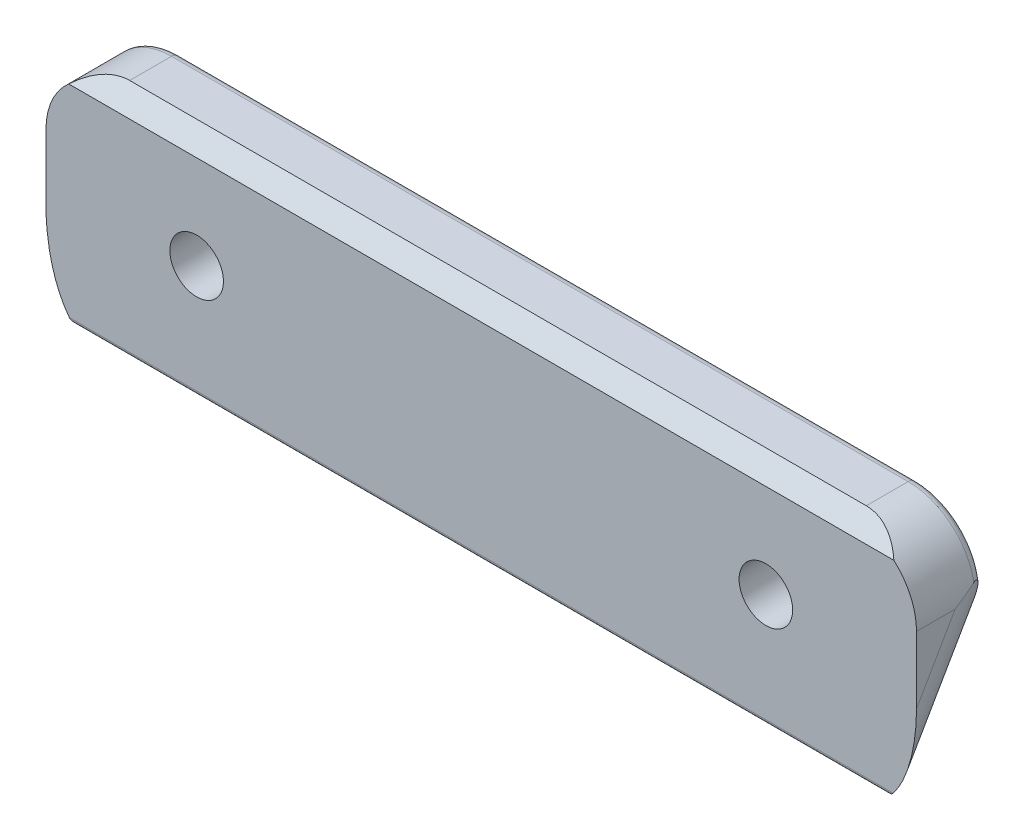
ISO-10303-21;
HEADER;
FILE_DESCRIPTION(('STEP AP214'),'2;1');
FILE_NAME('part.step','',(''),(''),'','','');
FILE_SCHEMA(('AUTOMOTIVE_DESIGN { 1 0 10303 214 1 1 1 1 }'));
ENDSEC;
DATA;
#1=APPLICATION_CONTEXT('core data for automotive mechanical design processes');
#2=APPLICATION_PROTOCOL_DEFINITION('international standard','automotive_design',2000,#1);
#3=PRODUCT_CONTEXT('',#1,'mechanical');
#4=PRODUCT('Part','Part','',(#3));
#5=PRODUCT_RELATED_PRODUCT_CATEGORY('part','',(#4));
#6=PRODUCT_DEFINITION_FORMATION('','',#4);
#7=PRODUCT_DEFINITION_CONTEXT('part definition',#1,'design');
#8=PRODUCT_DEFINITION('design','',#6,#7);
#9=PRODUCT_DEFINITION_SHAPE('','',#8);
#10=(LENGTH_UNIT() NAMED_UNIT(*) SI_UNIT(.MILLI.,.METRE.));
#11=(NAMED_UNIT(*) PLANE_ANGLE_UNIT() SI_UNIT($,.RADIAN.));
#12=(NAMED_UNIT(*) SI_UNIT($,.STERADIAN.) SOLID_ANGLE_UNIT());
#13=UNCERTAINTY_MEASURE_WITH_UNIT(LENGTH_MEASURE(1.E-05),#10,'distance_accuracy_value','');
#14=(GEOMETRIC_REPRESENTATION_CONTEXT(3) GLOBAL_UNCERTAINTY_ASSIGNED_CONTEXT((#13)) GLOBAL_UNIT_ASSIGNED_CONTEXT((#10,
#11,#12)) REPRESENTATION_CONTEXT('',''));
#15=CARTESIAN_POINT('',(0.,0.,0.));
#16=DIRECTION('',(0.,0.,1.));
#17=DIRECTION('',(1.,0.,0.));
#18=AXIS2_PLACEMENT_3D('',#15,#16,#17);
#19=CARTESIAN_POINT('',(73.,3.46410161513782,-2.));
#20=DIRECTION('',(0.,0.,1.));
#21=DIRECTION('',(1.,0.,0.));
#22=AXIS2_PLACEMENT_3D('',#19,#20,#21);
#23=PLANE('',#22);
#24=CARTESIAN_POINT('',(48.5,6.46410161513786,-2.));
#25=DIRECTION('',(0.,0.,1.));
#26=DIRECTION('',(0.,1.,0.));
#27=AXIS2_PLACEMENT_3D('',#24,#25,#26);
#28=ELLIPSE('',#27,3.00000000000004,1.5);
#29=CARTESIAN_POINT('',(48.5,3.46410161513782,-2.));
#30=VERTEX_POINT('',#29);
#31=CARTESIAN_POINT('',(47.2672441064119,4.75493467557492,-2.));
#32=VERTEX_POINT('',#31);
#33=EDGE_CURVE('E334',#30,#32,#28,.F.);
#34=ORIENTED_EDGE('',*,*,#33,.T.);
#35=CARTESIAN_POINT('',(49.,5.,-2.));
#36=DIRECTION('',(0.,0.,1.));
#37=DIRECTION('',(1.,0.,0.));
#38=AXIS2_PLACEMENT_3D('',#35,#36,#37);
#39=CIRCLE('',#38,1.75);
#40=CARTESIAN_POINT('',(49.,6.75,-2.));
#41=VERTEX_POINT('',#40);
#42=EDGE_CURVE('E323',#32,#41,#39,.F.);
#43=ORIENTED_EDGE('',*,*,#42,.T.);
#44=DIRECTION('',(-1.,0.,0.));
#45=VECTOR('',#44,1.);
#46=CARTESIAN_POINT('',(73.,6.75,-2.));
#47=LINE('',#46,#45);
#48=CARTESIAN_POINT('',(71.,6.75,-2.));
#49=VERTEX_POINT('',#48);
#50=EDGE_CURVE('E157',#41,#49,#47,.F.);
#51=ORIENTED_EDGE('',*,*,#50,.T.);
#52=CARTESIAN_POINT('',(71.,5.,-2.));
#53=DIRECTION('',(0.,0.,1.));
#54=DIRECTION('',(1.,0.,0.));
#55=AXIS2_PLACEMENT_3D('',#52,#53,#54);
#56=CIRCLE('',#55,1.75);
#57=CARTESIAN_POINT('',(72.7327558935881,4.75493467557492,-2.));
#58=VERTEX_POINT('',#57);
#59=EDGE_CURVE('E320',#49,#58,#56,.F.);
#60=ORIENTED_EDGE('',*,*,#59,.T.);
#61=CARTESIAN_POINT('',(71.5,6.46410161513786,-2.));
#62=DIRECTION('',(0.,0.,1.));
#63=DIRECTION('',(0.,-1.,0.));
#64=AXIS2_PLACEMENT_3D('',#61,#62,#63);
#65=ELLIPSE('',#64,3.00000000000004,1.5);
#66=CARTESIAN_POINT('',(71.5,3.46410161513782,-2.));
#67=VERTEX_POINT('',#66);
#68=EDGE_CURVE('E173',#58,#67,#65,.F.);
#69=ORIENTED_EDGE('',*,*,#68,.T.);
#70=DIRECTION('',(-1.,0.,0.));
#71=VECTOR('',#70,1.);
#72=CARTESIAN_POINT('',(73.,3.46410161513782,-2.));
#73=LINE('',#72,#71);
#74=CARTESIAN_POINT('',(69.2638081222336,3.46410161513781,-2.));
#75=VERTEX_POINT('',#74);
#76=EDGE_CURVE('E164',#67,#75,#73,.T.);
#77=ORIENTED_EDGE('',*,*,#76,.T.);
#78=CARTESIAN_POINT('',(68.5,3.70200317547306,-2.));
#79=DIRECTION('',(0.,0.,1.));
#80=DIRECTION('',(1.,0.,0.));
#81=AXIS2_PLACEMENT_3D('',#78,#79,#80);
#82=CIRCLE('',#81,0.799999999999988);
#83=CARTESIAN_POINT('',(67.7361918777664,3.46410161513782,-2.));
#84=VERTEX_POINT('',#83);
#85=EDGE_CURVE('E149',#75,#84,#82,.T.);
#86=ORIENTED_EDGE('',*,*,#85,.T.);
#87=CARTESIAN_POINT('',(52.2638081222336,3.46410161513782,-2.));
#88=VERTEX_POINT('',#87);
#89=EDGE_CURVE('E167',#84,#88,#73,.T.);
#90=ORIENTED_EDGE('',*,*,#89,.T.);
#91=CARTESIAN_POINT('',(51.5,3.70200317547306,-2.));
#92=DIRECTION('',(0.,0.,-1.));
#93=DIRECTION('',(-1.,0.,0.));
#94=AXIS2_PLACEMENT_3D('',#91,#92,#93);
#95=CIRCLE('',#94,0.799999999999988);
#96=CARTESIAN_POINT('',(50.7361918777664,3.46410161513782,-2.));
#97=VERTEX_POINT('',#96);
#98=EDGE_CURVE('E169',#97,#88,#95,.T.);
#99=ORIENTED_EDGE('',*,*,#98,.F.);
#100=EDGE_CURVE('E177',#97,#30,#73,.T.);
#101=ORIENTED_EDGE('',*,*,#100,.T.);
#102=EDGE_LOOP('',(#34,#43,#51,#60,#69,#77,#86,#90,#99,#101));
#103=FACE_BOUND('',#102,.T.);
#104=ADVANCED_FACE('F45',(#103),#23,.F.);
#105=CARTESIAN_POINT('',(73.,7.,-2.));
#106=DIRECTION('',(0.,-1.,0.));
#107=DIRECTION('',(0.,0.,-1.));
#108=AXIS2_PLACEMENT_3D('',#105,#106,#107);
#109=PLANE('',#108);
#110=DIRECTION('',(0.,0.,1.));
#111=VECTOR('',#110,1.);
#112=CARTESIAN_POINT('',(71.,7.,-2.));
#113=LINE('',#112,#111);
#114=CARTESIAN_POINT('',(71.,7.,-0.5));
#115=VERTEX_POINT('',#114);
#116=CARTESIAN_POINT('',(71.,7.,-1.75));
#117=VERTEX_POINT('',#116);
#118=EDGE_CURVE('E420',#115,#117,#113,.F.);
#119=ORIENTED_EDGE('',*,*,#118,.T.);
#120=DIRECTION('',(-1.,0.,0.));
#121=VECTOR('',#120,1.);
#122=CARTESIAN_POINT('',(73.,7.,-1.75));
#123=LINE('',#122,#121);
#124=CARTESIAN_POINT('',(49.,7.,-1.75));
#125=VERTEX_POINT('',#124);
#126=EDGE_CURVE('E11',#117,#125,#123,.T.);
#127=ORIENTED_EDGE('',*,*,#126,.T.);
#128=DIRECTION('',(0.,0.,1.));
#129=VECTOR('',#128,1.);
#130=CARTESIAN_POINT('',(49.,7.,-2.));
#131=LINE('',#130,#129);
#132=CARTESIAN_POINT('',(49.,7.,-0.5));
#133=VERTEX_POINT('',#132);
#134=EDGE_CURVE('E293',#125,#133,#131,.T.);
#135=ORIENTED_EDGE('',*,*,#134,.T.);
#136=DIRECTION('',(1.,0.,0.));
#137=VECTOR('',#136,1.);
#138=CARTESIAN_POINT('',(73.,7.,-0.5));
#139=LINE('',#138,#137);
#140=EDGE_CURVE('E375',#133,#115,#139,.T.);
#141=ORIENTED_EDGE('',*,*,#140,.T.);
#142=EDGE_LOOP('',(#119,#127,#135,#141));
#143=FACE_BOUND('',#142,.T.);
#144=ADVANCED_FACE('F250',(#143),#109,.F.);
#145=CARTESIAN_POINT('',(73.,7.,0.));
#146=DIRECTION('',(0.,0.,-1.));
#147=DIRECTION('',(0.,1.,0.));
#148=AXIS2_PLACEMENT_3D('',#145,#146,#147);
#149=PLANE('',#148);
#150=CARTESIAN_POINT('',(68.5,3.70200317547306,0.));
#151=DIRECTION('',(0.,0.,-1.));
#152=DIRECTION('',(-1.,0.,0.));
#153=AXIS2_PLACEMENT_3D('',#150,#151,#152);
#154=CIRCLE('',#153,0.799999999999981);
#155=CARTESIAN_POINT('',(67.7,3.70200317547306,0.));
#156=VERTEX_POINT('',#155);
#157=EDGE_CURVE('E170',#156,#156,#154,.T.);
#158=ORIENTED_EDGE('',*,*,#157,.T.);
#159=EDGE_LOOP('',(#158));
#160=FACE_BOUND('',#159,.T.);
#161=CARTESIAN_POINT('',(51.5,3.70200317547306,0.));
#162=DIRECTION('',(0.,0.,-1.));
#163=DIRECTION('',(-1.,0.,0.));
#164=AXIS2_PLACEMENT_3D('',#161,#162,#163);
#165=CIRCLE('',#164,0.799999999999988);
#166=CARTESIAN_POINT('',(50.7,3.70200317547306,0.));
#167=VERTEX_POINT('',#166);
#168=EDGE_CURVE('E202',#167,#167,#165,.T.);
#169=ORIENTED_EDGE('',*,*,#168,.T.);
#170=EDGE_LOOP('',(#169));
#171=FACE_BOUND('',#170,.T.);
#172=DIRECTION('',(-1.,0.,0.));
#173=VECTOR('',#172,1.);
#174=CARTESIAN_POINT('',(73.,6.50000000000001,0.));
#175=LINE('',#174,#173);
#176=CARTESIAN_POINT('',(72.3228756555323,6.50000000000001,0.));
#177=VERTEX_POINT('',#176);
#178=CARTESIAN_POINT('',(47.6771243444677,6.50000000000001,0.));
#179=VERTEX_POINT('',#178);
#180=EDGE_CURVE('E273',#177,#179,#175,.T.);
#181=ORIENTED_EDGE('',*,*,#180,.T.);
#182=CARTESIAN_POINT('',(49.,5.,0.));
#183=DIRECTION('',(0.,0.,-1.));
#184=DIRECTION('',(0.,1.,0.));
#185=AXIS2_PLACEMENT_3D('',#182,#183,#184);
#186=CIRCLE('',#185,2.);
#187=CARTESIAN_POINT('',(47.,5.,0.));
#188=VERTEX_POINT('',#187);
#189=EDGE_CURVE('E370',#179,#188,#186,.F.);
#190=ORIENTED_EDGE('',*,*,#189,.T.);
#191=DIRECTION('',(0.,1.,0.));
#192=VECTOR('',#191,1.);
#193=CARTESIAN_POINT('',(47.,0.,0.));
#194=LINE('',#193,#192);
#195=CARTESIAN_POINT('',(47.,3.00000000000004,0.));
#196=VERTEX_POINT('',#195);
#197=EDGE_CURVE('E190',#196,#188,#194,.T.);
#198=ORIENTED_EDGE('',*,*,#197,.F.);
#199=CARTESIAN_POINT('',(48.5,3.00000000000004,0.));
#200=DIRECTION('',(0.,0.,-1.));
#201=DIRECTION('',(0.,1.,0.));
#202=AXIS2_PLACEMENT_3D('',#199,#200,#201);
#203=ELLIPSE('',#202,3.00000000000004,1.5);
#204=CARTESIAN_POINT('',(47.6966616637114,0.466506350946117,0.));
#205=VERTEX_POINT('',#204);
#206=EDGE_CURVE('E294',#196,#205,#203,.F.);
#207=ORIENTED_EDGE('',*,*,#206,.T.);
#208=DIRECTION('',(-1.,0.,0.));
#209=VECTOR('',#208,1.);
#210=CARTESIAN_POINT('',(73.,0.466506350946117,0.));
#211=LINE('',#210,#209);
#212=CARTESIAN_POINT('',(72.3033383362886,0.466506350946118,0.));
#213=VERTEX_POINT('',#212);
#214=EDGE_CURVE('E274',#205,#213,#211,.F.);
#215=ORIENTED_EDGE('',*,*,#214,.T.);
#216=CARTESIAN_POINT('',(71.5,3.00000000000004,0.));
#217=DIRECTION('',(0.,0.,-1.));
#218=DIRECTION('',(0.,-1.,0.));
#219=AXIS2_PLACEMENT_3D('',#216,#217,#218);
#220=ELLIPSE('',#219,3.00000000000004,1.5);
#221=CARTESIAN_POINT('',(73.,3.00000000000004,0.));
#222=VERTEX_POINT('',#221);
#223=EDGE_CURVE('E426',#213,#222,#220,.F.);
#224=ORIENTED_EDGE('',*,*,#223,.T.);
#225=DIRECTION('',(0.,-1.,0.));
#226=VECTOR('',#225,1.);
#227=CARTESIAN_POINT('',(73.,7.,0.));
#228=LINE('',#227,#226);
#229=CARTESIAN_POINT('',(73.,5.,0.));
#230=VERTEX_POINT('',#229);
#231=EDGE_CURVE('E184',#230,#222,#228,.T.);
#232=ORIENTED_EDGE('',*,*,#231,.F.);
#233=CARTESIAN_POINT('',(71.,5.,0.));
#234=DIRECTION('',(0.,0.,-1.));
#235=DIRECTION('',(0.,1.,0.));
#236=AXIS2_PLACEMENT_3D('',#233,#234,#235);
#237=CIRCLE('',#236,2.);
#238=EDGE_CURVE('E371',#230,#177,#237,.F.);
#239=ORIENTED_EDGE('',*,*,#238,.T.);
#240=EDGE_LOOP('',(#181,#190,#198,#207,#215,#224,#232,#239));
#241=FACE_BOUND('',#240,.T.);
#242=ADVANCED_FACE('F353',(#160,#171,#241),#149,.F.);
#243=CARTESIAN_POINT('',(73.,0.,0.));
#244=DIRECTION('',(0.,0.499999999999993,0.866025403784442));
#245=DIRECTION('',(0.,-0.866025403784443,0.499999999999993));
#246=AXIS2_PLACEMENT_3D('',#243,#244,#245);
#247=PLANE('',#246);
#248=ORIENTED_EDGE('',*,*,#89,.F.);
#249=CARTESIAN_POINT('',(68.5,3.70200317547306,-2.13735252990018));
#250=DIRECTION('',(0.,0.499999999999993,0.866025403784442));
#251=DIRECTION('',(0.,0.866025403784443,-0.499999999999993));
#252=AXIS2_PLACEMENT_3D('',#249,#250,#251);
#253=ELLIPSE('',#252,0.923760430703384,0.799999999999988);
#254=EDGE_CURVE('E152',#84,#75,#253,.T.);
#255=ORIENTED_EDGE('',*,*,#254,.T.);
#256=ORIENTED_EDGE('',*,*,#76,.F.);
#257=DIRECTION('',(0.,0.866025403784443,-0.499999999999993));
#258=VECTOR('',#257,1.);
#259=CARTESIAN_POINT('',(71.5,0.,0.));
#260=LINE('',#259,#258);
#261=CARTESIAN_POINT('',(71.5,0.404006350946118,-0.233253175473056));
#262=VERTEX_POINT('',#261);
#263=EDGE_CURVE('E429',#67,#262,#260,.F.);
#264=ORIENTED_EDGE('',*,*,#263,.T.);
#265=DIRECTION('',(-1.,0.,0.));
#266=VECTOR('',#265,1.);
#267=CARTESIAN_POINT('',(73.,0.404006350946118,-0.233253175473056));
#268=LINE('',#267,#266);
#269=CARTESIAN_POINT('',(48.5,0.404006350946118,-0.233253175473056));
#270=VERTEX_POINT('',#269);
#271=EDGE_CURVE('E416',#262,#270,#268,.T.);
#272=ORIENTED_EDGE('',*,*,#271,.T.);
#273=DIRECTION('',(0.,0.866025403784443,-0.499999999999993));
#274=VECTOR('',#273,1.);
#275=CARTESIAN_POINT('',(48.5,0.,0.));
#276=LINE('',#275,#274);
#277=EDGE_CURVE('E339',#270,#30,#276,.T.);
#278=ORIENTED_EDGE('',*,*,#277,.T.);
#279=ORIENTED_EDGE('',*,*,#100,.F.);
#280=CARTESIAN_POINT('',(51.5,3.70200317547306,-2.13735252990018));
#281=DIRECTION('',(0.,0.499999999999993,0.866025403784442));
#282=DIRECTION('',(0.,0.866025403784443,-0.499999999999993));
#283=AXIS2_PLACEMENT_3D('',#280,#281,#282);
#284=ELLIPSE('',#283,0.923760430703384,0.799999999999988);
#285=EDGE_CURVE('E197',#97,#88,#284,.T.);
#286=ORIENTED_EDGE('',*,*,#285,.T.);
#287=EDGE_LOOP('',(#248,#255,#256,#264,#272,#278,#279,#286));
#288=FACE_BOUND('',#287,.T.);
#289=ADVANCED_FACE('F162',(#288),#247,.F.);
#290=CARTESIAN_POINT('',(73.,0.,0.));
#291=DIRECTION('',(1.,0.,0.));
#292=DIRECTION('',(0.,0.,-1.));
#293=AXIS2_PLACEMENT_3D('',#290,#291,#292);
#294=PLANE('',#293);
#295=DIRECTION('',(0.,0.866025403784443,-0.499999999999993));
#296=VECTOR('',#295,1.);
#297=CARTESIAN_POINT('',(73.,4.21410161513781,-0.700961894323337));
#298=LINE('',#297,#296);
#299=CARTESIAN_POINT('',(73.,5.,-1.15470053837921));
#300=VERTEX_POINT('',#299);
#301=EDGE_CURVE('E175',#222,#300,#298,.T.);
#302=ORIENTED_EDGE('',*,*,#301,.T.);
#303=DIRECTION('',(0.,0.,1.));
#304=VECTOR('',#303,1.);
#305=CARTESIAN_POINT('',(73.,5.,0.));
#306=LINE('',#305,#304);
#307=EDGE_CURVE('E423',#300,#230,#306,.T.);
#308=ORIENTED_EDGE('',*,*,#307,.T.);
#309=ORIENTED_EDGE('',*,*,#231,.T.);
#310=EDGE_LOOP('',(#302,#308,#309));
#311=FACE_BOUND('',#310,.T.);
#312=ADVANCED_FACE('F249',(#311),#294,.T.);
#313=CARTESIAN_POINT('',(71.5,0.749999999999989,1.29903810567666));
#314=DIRECTION('',(0.,-0.866025403784443,0.499999999999993));
#315=DIRECTION('',(0.,-0.499999999999993,-0.866025403784443));
#316=AXIS2_PLACEMENT_3D('',#313,#314,#315);
#317=CYLINDRICAL_SURFACE('',#316,1.5);
#318=ORIENTED_EDGE('',*,*,#68,.F.);
#319=CARTESIAN_POINT('',(72.7327558935881,4.75493467557493,-2.));
#320=CARTESIAN_POINT('',(72.7395170974083,4.77444049978442,-1.99999775763626));
#321=CARTESIAN_POINT('',(72.7461756716318,4.79398250895714,-1.99990602112907));
#322=CARTESIAN_POINT('',(72.7593230730698,4.83312800297112,-1.99945471471934));
#323=CARTESIAN_POINT('',(72.7658118394572,4.8527315070991,-1.99909505016552));
#324=CARTESIAN_POINT('',(72.7852432670711,4.91212775323866,-1.99746630332613));
#325=CARTESIAN_POINT('',(72.7979699111735,4.95197764912317,-1.99564259078778));
#326=CARTESIAN_POINT('',(72.8233529867402,5.03233978980987,-1.98940656331436));
#327=CARTESIAN_POINT('',(72.8360040362125,5.07285105322397,-1.98494826958053));
#328=CARTESIAN_POINT('',(72.8548885432478,5.13296902294581,-1.97486735389876));
#329=CARTESIAN_POINT('',(72.8611511689767,5.15284713828531,-1.97095663186988));
#330=CARTESIAN_POINT('',(72.8736752519363,5.1922409568881,-1.96163079661194));
#331=CARTESIAN_POINT('',(72.8799367026208,5.21175704109388,-1.95621737309272));
#332=CARTESIAN_POINT('',(72.8898343711833,5.24204076938239,-1.94605657531098));
#333=CARTESIAN_POINT('',(72.8934670811476,5.2530355185594,-1.94198672323065));
#334=CARTESIAN_POINT('',(72.9007516942952,5.27472893262587,-1.93298748702939));
#335=CARTESIAN_POINT('',(72.9044036122319,5.28542610159674,-1.92805444115827));
#336=CARTESIAN_POINT('',(72.9127244853669,5.30920930509752,-1.91562471093036));
#337=CARTESIAN_POINT('',(72.9173921004261,5.32212626396022,-1.90779692010482));
#338=CARTESIAN_POINT('',(72.9266538936081,5.34630250290987,-1.88988426453134));
#339=CARTESIAN_POINT('',(72.9312483603601,5.3575743404792,-1.87981815907657));
#340=CARTESIAN_POINT('',(72.9374496696154,5.37090070312588,-1.86384792442803));
#341=CARTESIAN_POINT('',(72.939161571736,5.37437001478333,-1.85917471218608));
#342=CARTESIAN_POINT('',(72.942527484565,5.38063878533565,-1.84936723691236));
#343=CARTESIAN_POINT('',(72.9441814695126,5.38343794930872,-1.84423277225237));
#344=CARTESIAN_POINT('',(72.9474130937451,5.38818355748631,-1.83347214001841));
#345=CARTESIAN_POINT('',(72.948989586239,5.3901194257173,-1.8278408353296));
#346=CARTESIAN_POINT('',(72.951989442459,5.39285820087968,-1.81627573374772));
#347=CARTESIAN_POINT('',(72.9534131932607,5.39366403730887,-1.81034276048165));
#348=CARTESIAN_POINT('',(72.9559223029142,5.3939962904921,-1.79901024729969));
#349=CARTESIAN_POINT('',(72.9570274047894,5.39364577185487,-1.79361860380967));
#350=CARTESIAN_POINT('',(72.9590552908755,5.391946304517,-1.7829467237814));
#351=CARTESIAN_POINT('',(72.9599776117549,5.39059485858582,-1.7776667999229));
#352=CARTESIAN_POINT('',(72.9614448434276,5.38742796238778,-1.76857350672998));
#353=CARTESIAN_POINT('',(72.9620277839896,5.38579034628646,-1.76470180302338));
#354=CARTESIAN_POINT('',(72.9630884674966,5.38208304500356,-1.7571821587168));
#355=CARTESIAN_POINT('',(72.9635667838573,5.38001584259055,-1.75353308172655));
#356=CARTESIAN_POINT('',(72.9639989042006,5.3777675267924,-1.75000000000027));
#357=B_SPLINE_CURVE_WITH_KNOTS('',3,(#319,#320,#321,#322,#323,#324,#325,#326,#327,#328,#329,
#330,#331,#332,#333,#334,#335,#336,#337,#338,#339,#340,#341,#342,#343,#344,#345,#346,#347,#348,
#349,#350,#351,#352,#353,#354,#355,#356),.UNSPECIFIED.,.F.,.F.,(4,2,2,2,2,2,2,2,2,2,2,2,2,2,2,2,
2,2,4),(0.,0.0619335280278836,0.123888945772995,0.249475074404342,0.377320500881206,
0.440899190720418,0.5044066772129,0.541202845028607,0.57815906713712,0.62545584420112,
0.67237024330051,0.690527962694336,0.708693658395345,0.72707616243203,0.74541092295429,
0.761859944604576,0.778350144032809,0.791053346399666,0.803685077327109),.UNSPECIFIED.);
#358=CARTESIAN_POINT('',(72.9639989042011,5.37776752679322,-1.74999999999999));
#359=VERTEX_POINT('',#358);
#360=EDGE_CURVE('E71',#58,#359,#357,.T.);
#361=ORIENTED_EDGE('',*,*,#360,.T.);
#362=CARTESIAN_POINT('',(72.9265702218557,5.53696106028184,-2.));
#363=CARTESIAN_POINT('',(72.9388757188599,5.4927860477756,-1.93074399078035));
#364=CARTESIAN_POINT('',(72.9495772662274,5.44854091117917,-1.86126870188502));
#365=CARTESIAN_POINT('',(72.9678668561814,5.35993391776195,-1.72197413472637));
#366=CARTESIAN_POINT('',(72.9754546269643,5.31557205109173,-1.65215482697154));
#367=CARTESIAN_POINT('',(72.9936512454994,5.18261292564464,-1.44274208927757));
#368=CARTESIAN_POINT('',(72.9997628618398,5.09388843759482,-1.30279543343849));
#369=CARTESIAN_POINT('',(72.9999977367986,5.00346886347651,-1.16017215074148));
#370=CARTESIAN_POINT('',(72.9999999926982,5.00173442342607,-1.15743633124916));
#371=CARTESIAN_POINT('',(73.0000000000032,5.,-1.15470053837921));
#372=B_SPLINE_CURVE_WITH_KNOTS('',3,(#362,#363,#364,#365,#366,#367,#368,#369,#370,#371),
.UNSPECIFIED.,.F.,.F.,(4,2,2,2,4),(0.,0.249136779543129,0.498295301776333,0.99518329594325,
1.00490115988303),.UNSPECIFIED.);
#373=EDGE_CURVE('E257',#359,#300,#372,.T.);
#374=ORIENTED_EDGE('',*,*,#373,.T.);
#375=ORIENTED_EDGE('',*,*,#301,.F.);
#376=ORIENTED_EDGE('',*,*,#223,.F.);
#377=CARTESIAN_POINT('',(72.3033383362886,0.466506350946117,0.));
#378=CARTESIAN_POINT('',(72.2966156243106,0.458040202272838,-4.21443768529623E-05));
#379=CARTESIAN_POINT('',(72.2892356120005,0.450248758558305,-0.000854747947312416));
#380=CARTESIAN_POINT('',(72.2736670428909,0.435951480401636,-0.00356728335651623));
#381=CARTESIAN_POINT('',(72.2654911755587,0.42942925522484,-0.0054519171724534));
#382=CARTESIAN_POINT('',(72.24293294971,0.413311170136318,-0.0113756972376357));
#383=CARTESIAN_POINT('',(72.2280882294554,0.40461453772296,-0.0160103004099952));
#384=CARTESIAN_POINT('',(72.1975308382103,0.389324630349213,-0.0262433403742448));
#385=CARTESIAN_POINT('',(72.1818112570209,0.38275213920744,-0.0318505218948478));
#386=CARTESIAN_POINT('',(72.1496347332211,0.371261994131281,-0.0436228931889291));
#387=CARTESIAN_POINT('',(72.1331695872878,0.366376524697895,-0.0497963606994248));
#388=CARTESIAN_POINT('',(72.0999293543843,0.358096425481984,-0.0623226341953332));
#389=CARTESIAN_POINT('',(72.0831539922487,0.354703192641505,-0.0686756023238155));
#390=CARTESIAN_POINT('',(72.032545864881,0.346396145294435,-0.087702306451146));
#391=CARTESIAN_POINT('',(71.9983999043237,0.343345028162557,-0.100355903693112));
#392=CARTESIAN_POINT('',(71.9265407549691,0.340797231014923,-0.125881725376579));
#393=CARTESIAN_POINT('',(71.8887885219287,0.341653579795671,-0.138666863023334));
#394=CARTESIAN_POINT('',(71.81297357375,0.346679088103613,-0.162633044294978));
#395=CARTESIAN_POINT('',(71.7749105228575,0.35085248957358,-0.173812012274771));
#396=CARTESIAN_POINT('',(71.660530144111,0.367208849198602,-0.204365195908817));
#397=CARTESIAN_POINT('',(71.5839080613838,0.3832289388691,-0.22079817453297));
#398=CARTESIAN_POINT('',(71.5049612315508,0.402769162458047,-0.232531771873748));
#399=CARTESIAN_POINT('',(71.5024805239937,0.403386265021466,-0.232895160581712));
#400=CARTESIAN_POINT('',(71.5,0.404006350946118,-0.233253175473056));
#401=B_SPLINE_CURVE_WITH_KNOTS('',3,(#377,#378,#379,#380,#381,#382,#383,#384,#385,#386,#387,
#388,#389,#390,#391,#392,#393,#394,#395,#396,#397,#398,#399,#400),.UNSPECIFIED.,.F.,.F.,(4,2,2,
2,2,2,2,2,2,2,2,4),(0.,0.0321957182121593,0.0639431282121233,0.117132453950745,
0.170827478066513,0.225496615363121,0.280216822233322,0.389553675198736,0.508954723214407,
0.628508710896519,0.867257211572928,0.875003200269996),.UNSPECIFIED.);
#402=EDGE_CURVE('E265',#213,#262,#401,.T.);
#403=ORIENTED_EDGE('',*,*,#402,.T.);
#404=ORIENTED_EDGE('',*,*,#263,.F.);
#405=EDGE_LOOP('',(#318,#361,#374,#375,#376,#403,#404));
#406=FACE_BOUND('',#405,.T.);
#407=ADVANCED_FACE('F243',(#406),#317,.T.);
#408=CARTESIAN_POINT('',(71.,5.,0.));
#409=DIRECTION('',(0.,0.,-1.));
#410=DIRECTION('',(-1.,0.,0.));
#411=AXIS2_PLACEMENT_3D('',#408,#409,#410);
#412=CYLINDRICAL_SURFACE('',#411,2.);
#413=ORIENTED_EDGE('',*,*,#373,.F.);
#414=CARTESIAN_POINT('',(71.,5.,-1.75));
#415=DIRECTION('',(0.,0.,1.));
#416=DIRECTION('',(1.,0.,0.));
#417=AXIS2_PLACEMENT_3D('',#414,#415,#416);
#418=CIRCLE('',#417,2.);
#419=EDGE_CURVE('E56',#359,#117,#418,.T.);
#420=ORIENTED_EDGE('',*,*,#419,.T.);
#421=ORIENTED_EDGE('',*,*,#118,.F.);
#422=CARTESIAN_POINT('',(71.,5.,1.50000000000003));
#423=DIRECTION('',(0.,-0.707106781186552,-0.707106781186543));
#424=DIRECTION('',(0.,0.707106781186543,-0.707106781186552));
#425=AXIS2_PLACEMENT_3D('',#422,#423,#424);
#426=ELLIPSE('',#425,2.82842712474621,2.);
#427=EDGE_CURVE('E411',#115,#177,#426,.T.);
#428=ORIENTED_EDGE('',*,*,#427,.T.);
#429=ORIENTED_EDGE('',*,*,#238,.F.);
#430=ORIENTED_EDGE('',*,*,#307,.F.);
#431=EDGE_LOOP('',(#413,#420,#421,#428,#429,#430));
#432=FACE_BOUND('',#431,.T.);
#433=ADVANCED_FACE('F248',(#432),#412,.T.);
#434=CARTESIAN_POINT('',(73.,0.466506350946117,-0.125000000000001));
#435=DIRECTION('',(-1.,0.,0.));
#436=DIRECTION('',(0.,0.,1.));
#437=AXIS2_PLACEMENT_3D('',#434,#435,#436);
#438=CYLINDRICAL_SURFACE('',#437,0.125);
#439=ORIENTED_EDGE('',*,*,#214,.F.);
#440=CARTESIAN_POINT('',(47.6966616637114,0.466506350946117,0.));
#441=CARTESIAN_POINT('',(47.7033843756893,0.458040202272835,-4.21443768535656E-05));
#442=CARTESIAN_POINT('',(47.7107643879994,0.450248758558302,-0.00085474794731303));
#443=CARTESIAN_POINT('',(47.7263329571091,0.435951480401636,-0.00356728335651621));
#444=CARTESIAN_POINT('',(47.7345088244413,0.429429255224842,-0.00545191717245295));
#445=CARTESIAN_POINT('',(47.75706705029,0.413311170136321,-0.0113756972376347));
#446=CARTESIAN_POINT('',(47.7719117705446,0.404614537722961,-0.0160103004099944));
#447=CARTESIAN_POINT('',(47.8024691617897,0.389324630349214,-0.0262433403742444));
#448=CARTESIAN_POINT('',(47.8181887429791,0.382752139207441,-0.0318505218948474));
#449=CARTESIAN_POINT('',(47.8503652667789,0.371261994131283,-0.0436228931889266));
#450=CARTESIAN_POINT('',(47.8668304127122,0.366376524697898,-0.0497963606994201));
#451=CARTESIAN_POINT('',(47.9000706456157,0.358096425481988,-0.0623226341953275));
#452=CARTESIAN_POINT('',(47.9168460077513,0.354703192641507,-0.0686756023238111));
#453=CARTESIAN_POINT('',(47.967454135119,0.346396145294437,-0.0877023064511412));
#454=CARTESIAN_POINT('',(48.0016000956763,0.34334502816256,-0.100355903693105));
#455=CARTESIAN_POINT('',(48.0734592450309,0.340797231014922,-0.125881725376569));
#456=CARTESIAN_POINT('',(48.1112114780713,0.341653579795666,-0.138666863023323));
#457=CARTESIAN_POINT('',(48.18702642625,0.346679088103615,-0.162633044294976));
#458=CARTESIAN_POINT('',(48.2250894771425,0.350852489573592,-0.173812012274776));
#459=CARTESIAN_POINT('',(48.339469855889,0.367208849198577,-0.204365195908804));
#460=CARTESIAN_POINT('',(48.4160919386162,0.383228938868963,-0.220798174532891));
#461=CARTESIAN_POINT('',(48.4950387684492,0.402769162458043,-0.232531771873746));
#462=CARTESIAN_POINT('',(48.4975194760063,0.403386265021463,-0.23289516058171));
#463=CARTESIAN_POINT('',(48.5,0.404006350946118,-0.233253175473056));
#464=B_SPLINE_CURVE_WITH_KNOTS('',3,(#440,#441,#442,#443,#444,#445,#446,#447,#448,#449,#450,
#451,#452,#453,#454,#455,#456,#457,#458,#459,#460,#461,#462,#463),.UNSPECIFIED.,.F.,.F.,(4,2,2,
2,2,2,2,2,2,2,2,4),(0.,0.0321957182121505,0.0639431282121119,0.117132453950747,
0.170827478066508,0.225496615363095,0.280216822233304,0.389553675198702,0.508954723214381,
0.628508710896515,0.867257211572955,0.875003200269992),.UNSPECIFIED.);
#465=EDGE_CURVE('E285',#205,#270,#464,.T.);
#466=ORIENTED_EDGE('',*,*,#465,.T.);
#467=ORIENTED_EDGE('',*,*,#271,.F.);
#468=ORIENTED_EDGE('',*,*,#402,.F.);
#469=EDGE_LOOP('',(#439,#466,#467,#468));
#470=FACE_BOUND('',#469,.T.);
#471=ADVANCED_FACE('F276',(#470),#438,.T.);
#472=CARTESIAN_POINT('',(73.,6.50000000000001,0.));
#473=DIRECTION('',(0.,-0.707106781186552,-0.707106781186543));
#474=DIRECTION('',(-1.,0.,0.));
#475=AXIS2_PLACEMENT_3D('',#472,#473,#474);
#476=PLANE('',#475);
#477=ORIENTED_EDGE('',*,*,#140,.F.);
#478=CARTESIAN_POINT('',(49.,5.,1.50000000000003));
#479=DIRECTION('',(0.,-0.707106781186552,-0.707106781186543));
#480=DIRECTION('',(0.,-0.707106781186543,0.707106781186552));
#481=AXIS2_PLACEMENT_3D('',#478,#479,#480);
#482=ELLIPSE('',#481,2.82842712474621,2.);
#483=EDGE_CURVE('E378',#133,#179,#482,.F.);
#484=ORIENTED_EDGE('',*,*,#483,.T.);
#485=ORIENTED_EDGE('',*,*,#180,.F.);
#486=ORIENTED_EDGE('',*,*,#427,.F.);
#487=EDGE_LOOP('',(#477,#484,#485,#486));
#488=FACE_BOUND('',#487,.T.);
#489=ADVANCED_FACE('F280',(#488),#476,.F.);
#490=CARTESIAN_POINT('',(47.,0.,-10.));
#491=DIRECTION('',(1.,0.,0.));
#492=DIRECTION('',(0.,0.,-1.));
#493=AXIS2_PLACEMENT_3D('',#490,#491,#492);
#494=PLANE('',#493);
#495=ORIENTED_EDGE('',*,*,#197,.T.);
#496=DIRECTION('',(0.,0.,1.));
#497=VECTOR('',#496,1.);
#498=CARTESIAN_POINT('',(47.,5.,-10.));
#499=LINE('',#498,#497);
#500=CARTESIAN_POINT('',(47.,5.,-1.15470053837921));
#501=VERTEX_POINT('',#500);
#502=EDGE_CURVE('E315',#188,#501,#499,.F.);
#503=ORIENTED_EDGE('',*,*,#502,.T.);
#504=DIRECTION('',(0.,0.866025403784443,-0.499999999999993));
#505=VECTOR('',#504,1.);
#506=CARTESIAN_POINT('',(47.,5.08012701892214,-1.20096189432327));
#507=LINE('',#506,#505);
#508=EDGE_CURVE('E338',#501,#196,#507,.F.);
#509=ORIENTED_EDGE('',*,*,#508,.T.);
#510=EDGE_LOOP('',(#495,#503,#509));
#511=FACE_BOUND('',#510,.T.);
#512=ADVANCED_FACE('F302',(#511),#494,.F.);
#513=CARTESIAN_POINT('',(48.5,0.74999999999999,1.29903810567666));
#514=DIRECTION('',(0.,0.866025403784443,-0.499999999999993));
#515=DIRECTION('',(0.,0.499999999999993,0.866025403784443));
#516=AXIS2_PLACEMENT_3D('',#513,#514,#515);
#517=CYLINDRICAL_SURFACE('',#516,1.5);
#518=CARTESIAN_POINT('',(47.0734297781443,5.53696106028185,-2.));
#519=CARTESIAN_POINT('',(47.0611242811348,5.49278604777567,-1.93074399078045));
#520=CARTESIAN_POINT('',(47.05042273377,5.4485409111793,-1.86126870188521));
#521=CARTESIAN_POINT('',(47.0321331438211,5.35993391776101,-1.7219741347249));
#522=CARTESIAN_POINT('',(47.0245453730407,5.31557205108966,-1.6521548269683));
#523=CARTESIAN_POINT('',(47.0063487544898,5.18261292564253,-1.44274208927421));
#524=CARTESIAN_POINT('',(47.0002371381068,5.09388843759384,-1.3027954334368));
#525=CARTESIAN_POINT('',(47.0000022632024,5.00346886347651,-1.16017215074147));
#526=CARTESIAN_POINT('',(47.0000000073039,5.00173442342607,-1.15743633124916));
#527=CARTESIAN_POINT('',(47.,5.,-1.15470053837921));
#528=B_SPLINE_CURVE_WITH_KNOTS('',3,(#518,#519,#520,#521,#522,#523,#524,#525,#526,#527),
.UNSPECIFIED.,.F.,.F.,(4,2,2,2,4),(0.,0.249136779542789,0.498295301782287,0.995183295943261,
1.00490115988303),.UNSPECIFIED.);
#529=CARTESIAN_POINT('',(47.0360010957989,5.37776752679322,-1.74999999999999));
#530=VERTEX_POINT('',#529);
#531=EDGE_CURVE('E158',#501,#530,#528,.F.);
#532=ORIENTED_EDGE('',*,*,#531,.T.);
#533=CARTESIAN_POINT('',(47.0360010957995,5.37776752679311,-1.75));
#534=CARTESIAN_POINT('',(47.0365549593556,5.38065944225779,-1.75453316140147));
#535=CARTESIAN_POINT('',(47.0371876625482,5.38324919026018,-1.75927093236486));
#536=CARTESIAN_POINT('',(47.0386265082633,5.38767943157251,-1.76907975913193));
#537=CARTESIAN_POINT('',(47.0394333143893,5.3895169779483,-1.77415203707979));
#538=CARTESIAN_POINT('',(47.0412379520821,5.39228211923373,-1.78455140138889));
#539=CARTESIAN_POINT('',(47.042237006247,5.39320364408744,-1.78987994538527));
#540=CARTESIAN_POINT('',(47.0444087346187,5.39403238547678,-1.80056455293451));
#541=CARTESIAN_POINT('',(47.0455808989678,5.39394252426917,-1.80592049253209));
#542=CARTESIAN_POINT('',(47.0479679999906,5.3928372203946,-1.81605371413035));
#543=CARTESIAN_POINT('',(47.0491715566535,5.39189824380431,-1.82084244412873));
#544=CARTESIAN_POINT('',(47.0516728709404,5.3892957156052,-1.83019666839322));
#545=CARTESIAN_POINT('',(47.0529707801422,5.3876309756173,-1.83476178281132));
#546=CARTESIAN_POINT('',(47.0562802173832,5.38274241547406,-1.84575211877175));
#547=CARTESIAN_POINT('',(47.0583318604472,5.37915410277162,-1.85200241923024));
#548=CARTESIAN_POINT('',(47.0625159864069,5.37102710429904,-1.86381475581681));
#549=CARTESIAN_POINT('',(47.0646486373382,5.36648634354213,-1.86937524633746));
#550=CARTESIAN_POINT('',(47.0704426003051,5.35338471310994,-1.88347163628806));
#551=CARTESIAN_POINT('',(47.0741440273794,5.34421072266927,-1.89141552383899));
#552=CARTESIAN_POINT('',(47.0815859060484,5.32480260714835,-1.90583202906902));
#553=CARTESIAN_POINT('',(47.08532643259,5.31456586327283,-1.9123008804807));
#554=CARTESIAN_POINT('',(47.096870861829,5.28205095892015,-1.93046825813432));
#555=CARTESIAN_POINT('',(47.1046931123383,5.25872613256349,-1.94025400863849));
#556=CARTESIAN_POINT('',(47.1203584684811,5.21090282425802,-1.95667711865003));
#557=CARTESIAN_POINT('',(47.1282012693585,5.18639667536131,-1.96328960376377));
#558=CARTESIAN_POINT('',(47.1468717065873,5.12749054660524,-1.97639155796167));
#559=CARTESIAN_POINT('',(47.1577001298088,5.09287238686278,-1.98187779485231));
#560=CARTESIAN_POINT('',(47.1795067994631,5.02332018401501,-1.990239904342));
#561=CARTESIAN_POINT('',(47.1904853562155,4.98838556245609,-1.99310912152852));
#562=CARTESIAN_POINT('',(47.2122053843146,4.92020140225282,-1.99709879527887));
#563=CARTESIAN_POINT('',(47.2229328970603,4.88695155913023,-1.99829666116092));
#564=CARTESIAN_POINT('',(47.244759747286,4.82074180223127,-1.99972979502007));
#565=CARTESIAN_POINT('',(47.2558568758015,4.78778127824031,-1.99997000740613));
#566=CARTESIAN_POINT('',(47.2672441064119,4.75493467557493,-2.00000000000004));
#567=B_SPLINE_CURVE_WITH_KNOTS('',3,(#533,#534,#535,#536,#537,#538,#539,#540,#541,#542,#543,
#544,#545,#546,#547,#548,#549,#550,#551,#552,#553,#554,#555,#556,#557,#558,#559,#560,#561,#562,
#563,#564,#565,#566),.UNSPECIFIED.,.F.,.F.,(4,2,2,2,2,2,2,2,2,2,2,2,2,2,2,2,4),(0.,
0.0162318566104381,0.0325267105225326,0.0489288371860643,0.0652835844233719,0.0802978655684442,
0.0953368242722777,0.117688632892432,0.140089652166147,0.177936375362934,0.215878678156582,
0.294866089064986,0.374462938055957,0.484331984239831,0.594479668530737,0.699334320932492,
0.803646897355515),.UNSPECIFIED.);
#568=EDGE_CURVE('E235',#530,#32,#567,.T.);
#569=ORIENTED_EDGE('',*,*,#568,.T.);
#570=ORIENTED_EDGE('',*,*,#33,.F.);
#571=ORIENTED_EDGE('',*,*,#277,.F.);
#572=ORIENTED_EDGE('',*,*,#465,.F.);
#573=ORIENTED_EDGE('',*,*,#206,.F.);
#574=ORIENTED_EDGE('',*,*,#508,.F.);
#575=EDGE_LOOP('',(#532,#569,#570,#571,#572,#573,#574));
#576=FACE_BOUND('',#575,.T.);
#577=ADVANCED_FACE('F297',(#576),#517,.T.);
#578=CARTESIAN_POINT('',(49.,5.,-2.));
#579=DIRECTION('',(0.,0.,1.));
#580=DIRECTION('',(1.,0.,0.));
#581=AXIS2_PLACEMENT_3D('',#578,#579,#580);
#582=CYLINDRICAL_SURFACE('',#581,2.);
#583=ORIENTED_EDGE('',*,*,#134,.F.);
#584=CARTESIAN_POINT('',(49.,5.,-1.75));
#585=DIRECTION('',(0.,0.,1.));
#586=DIRECTION('',(1.,0.,0.));
#587=AXIS2_PLACEMENT_3D('',#584,#585,#586);
#588=CIRCLE('',#587,2.);
#589=EDGE_CURVE('E326',#125,#530,#588,.T.);
#590=ORIENTED_EDGE('',*,*,#589,.T.);
#591=ORIENTED_EDGE('',*,*,#531,.F.);
#592=ORIENTED_EDGE('',*,*,#502,.F.);
#593=ORIENTED_EDGE('',*,*,#189,.F.);
#594=ORIENTED_EDGE('',*,*,#483,.F.);
#595=EDGE_LOOP('',(#583,#590,#591,#592,#593,#594));
#596=FACE_BOUND('',#595,.T.);
#597=ADVANCED_FACE('F301',(#596),#582,.T.);
#598=CARTESIAN_POINT('',(51.5,3.70200317547306,-2.));
#599=DIRECTION('',(0.,0.,-1.));
#600=DIRECTION('',(-1.,0.,0.));
#601=AXIS2_PLACEMENT_3D('',#598,#599,#600);
#602=CYLINDRICAL_SURFACE('',#601,0.799999999999988);
#603=ORIENTED_EDGE('',*,*,#168,.F.);
#604=EDGE_LOOP('',(#603));
#605=FACE_BOUND('',#604,.T.);
#606=ORIENTED_EDGE('',*,*,#98,.T.);
#607=ORIENTED_EDGE('',*,*,#285,.F.);
#608=EDGE_LOOP('',(#606,#607));
#609=FACE_BOUND('',#608,.T.);
#610=ADVANCED_FACE('F390',(#605,#609),#602,.F.);
#611=CARTESIAN_POINT('',(68.5,3.70200317547306,-2.));
#612=DIRECTION('',(0.,0.,-1.));
#613=DIRECTION('',(-1.,0.,0.));
#614=AXIS2_PLACEMENT_3D('',#611,#612,#613);
#615=CYLINDRICAL_SURFACE('',#614,0.799999999999988);
#616=ORIENTED_EDGE('',*,*,#157,.F.);
#617=EDGE_LOOP('',(#616));
#618=FACE_BOUND('',#617,.T.);
#619=ORIENTED_EDGE('',*,*,#85,.F.);
#620=ORIENTED_EDGE('',*,*,#254,.F.);
#621=EDGE_LOOP('',(#619,#620));
#622=FACE_BOUND('',#621,.T.);
#623=ADVANCED_FACE('F151',(#618,#622),#615,.F.);
#624=CARTESIAN_POINT('',(71.,5.,-1.75));
#625=DIRECTION('',(0.,0.,1.));
#626=DIRECTION('',(1.,0.,0.));
#627=AXIS2_PLACEMENT_3D('',#624,#625,#626);
#628=TOROIDAL_SURFACE('',#627,1.75,0.25);
#629=ORIENTED_EDGE('',*,*,#360,.F.);
#630=ORIENTED_EDGE('',*,*,#59,.F.);
#631=CARTESIAN_POINT('',(71.,6.75,-1.75));
#632=DIRECTION('',(-1.,0.,0.));
#633=DIRECTION('',(0.,0.,1.));
#634=AXIS2_PLACEMENT_3D('',#631,#632,#633);
#635=CIRCLE('',#634,0.25);
#636=EDGE_CURVE('E50',#117,#49,#635,.T.);
#637=ORIENTED_EDGE('',*,*,#636,.F.);
#638=ORIENTED_EDGE('',*,*,#419,.F.);
#639=EDGE_LOOP('',(#629,#630,#637,#638));
#640=FACE_BOUND('',#639,.T.);
#641=ADVANCED_FACE('F47',(#640),#628,.T.);
#642=CARTESIAN_POINT('',(73.,6.75,-1.75));
#643=DIRECTION('',(-1.,0.,0.));
#644=DIRECTION('',(0.,0.,1.));
#645=AXIS2_PLACEMENT_3D('',#642,#643,#644);
#646=CYLINDRICAL_SURFACE('',#645,0.25);
#647=ORIENTED_EDGE('',*,*,#636,.T.);
#648=ORIENTED_EDGE('',*,*,#50,.F.);
#649=CARTESIAN_POINT('',(49.,6.75,-1.75));
#650=DIRECTION('',(-1.,0.,0.));
#651=DIRECTION('',(0.,0.,1.));
#652=AXIS2_PLACEMENT_3D('',#649,#650,#651);
#653=CIRCLE('',#652,0.25);
#654=EDGE_CURVE('E215',#125,#41,#653,.T.);
#655=ORIENTED_EDGE('',*,*,#654,.F.);
#656=ORIENTED_EDGE('',*,*,#126,.F.);
#657=EDGE_LOOP('',(#647,#648,#655,#656));
#658=FACE_BOUND('',#657,.T.);
#659=ADVANCED_FACE('F343',(#658),#646,.T.);
#660=CARTESIAN_POINT('',(49.,5.,-1.75));
#661=DIRECTION('',(0.,0.,1.));
#662=DIRECTION('',(1.,0.,0.));
#663=AXIS2_PLACEMENT_3D('',#660,#661,#662);
#664=TOROIDAL_SURFACE('',#663,1.75,0.25);
#665=ORIENTED_EDGE('',*,*,#568,.F.);
#666=ORIENTED_EDGE('',*,*,#589,.F.);
#667=ORIENTED_EDGE('',*,*,#654,.T.);
#668=ORIENTED_EDGE('',*,*,#42,.F.);
#669=EDGE_LOOP('',(#665,#666,#667,#668));
#670=FACE_BOUND('',#669,.T.);
#671=ADVANCED_FACE('F341',(#670),#664,.T.);
#672=CLOSED_SHELL('',(#104,#144,#242,#289,#312,#407,#433,#471,#489,#512,#577,#597,#610,#623,
#641,#659,#671));
#673=MANIFOLD_SOLID_BREP('B2',#672);
#674=ADVANCED_BREP_SHAPE_REPRESENTATION('',(#18,#673),#14);
#675=SHAPE_DEFINITION_REPRESENTATION(#9,#674);
ENDSEC;
END-ISO-10303-21;
